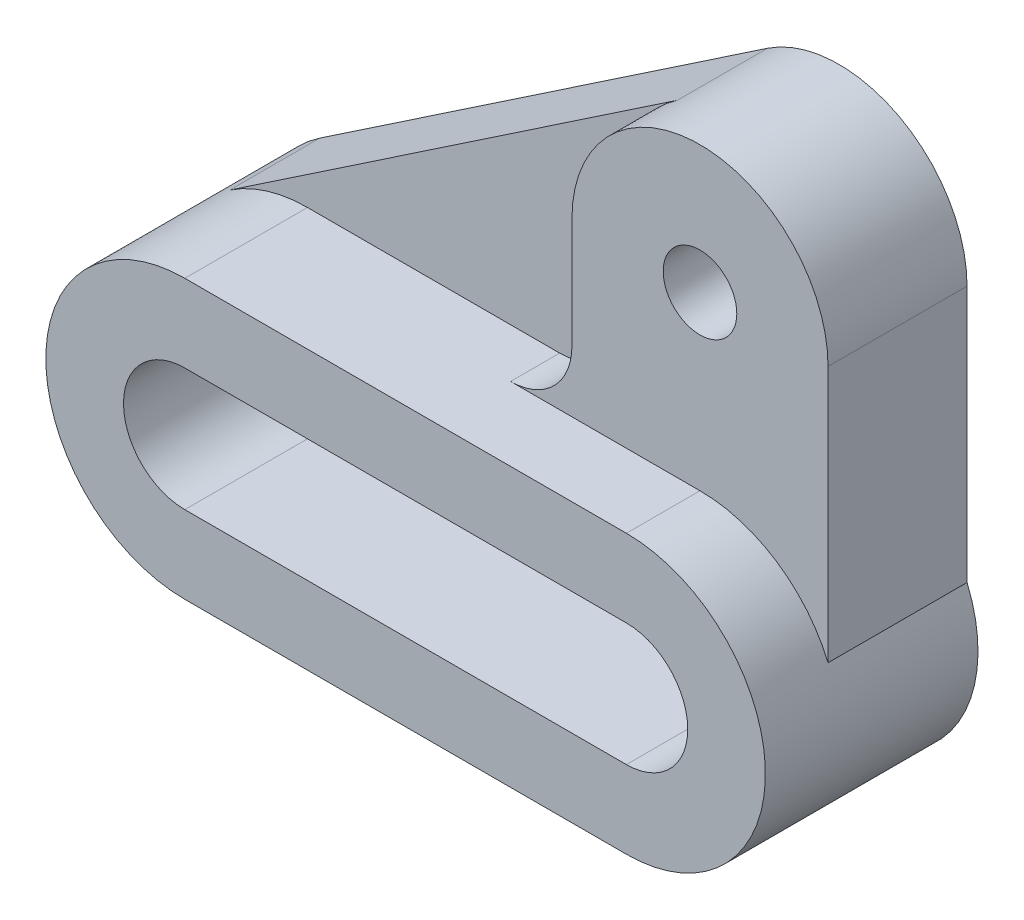
ISO-10303-21;
HEADER;
FILE_DESCRIPTION(('STEP AP214'),'2;1');
FILE_NAME('part.step','',(''),(''),'','','');
FILE_SCHEMA(('AUTOMOTIVE_DESIGN { 1 0 10303 214 1 1 1 1 }'));
ENDSEC;
DATA;
#1=APPLICATION_CONTEXT('core data for automotive mechanical design processes');
#2=APPLICATION_PROTOCOL_DEFINITION('international standard','automotive_design',2000,#1);
#3=PRODUCT_CONTEXT('',#1,'mechanical');
#4=PRODUCT('Part','Part','',(#3));
#5=PRODUCT_RELATED_PRODUCT_CATEGORY('part','',(#4));
#6=PRODUCT_DEFINITION_FORMATION('','',#4);
#7=PRODUCT_DEFINITION_CONTEXT('part definition',#1,'design');
#8=PRODUCT_DEFINITION('design','',#6,#7);
#9=PRODUCT_DEFINITION_SHAPE('','',#8);
#10=(LENGTH_UNIT() NAMED_UNIT(*) SI_UNIT(.MILLI.,.METRE.));
#11=(NAMED_UNIT(*) PLANE_ANGLE_UNIT() SI_UNIT($,.RADIAN.));
#12=(NAMED_UNIT(*) SI_UNIT($,.STERADIAN.) SOLID_ANGLE_UNIT());
#13=UNCERTAINTY_MEASURE_WITH_UNIT(LENGTH_MEASURE(1.E-05),#10,'distance_accuracy_value','');
#14=(GEOMETRIC_REPRESENTATION_CONTEXT(3) GLOBAL_UNCERTAINTY_ASSIGNED_CONTEXT((#13)) GLOBAL_UNIT_ASSIGNED_CONTEXT((#10,
#11,#12)) REPRESENTATION_CONTEXT('',''));
#15=CARTESIAN_POINT('',(0.,0.,0.));
#16=DIRECTION('',(0.,0.,1.));
#17=DIRECTION('',(1.,0.,0.));
#18=AXIS2_PLACEMENT_3D('',#15,#16,#17);
#19=CARTESIAN_POINT('',(0.,0.,52.));
#20=DIRECTION('',(0.,0.,-1.));
#21=DIRECTION('',(-1.,0.,0.));
#22=AXIS2_PLACEMENT_3D('',#19,#20,#21);
#23=CYLINDRICAL_SURFACE('',#22,34.);
#24=DIRECTION('',(0.,0.,-1.));
#25=VECTOR('',#24,1.);
#26=CARTESIAN_POINT('',(31.3199105560567,13.2311451794851,22.));
#27=LINE('',#26,#25);
#28=CARTESIAN_POINT('',(31.3199105560567,13.2311451794851,34.));
#29=VERTEX_POINT('',#28);
#30=CARTESIAN_POINT('',(31.3199105560567,13.2311451794851,0.));
#31=VERTEX_POINT('',#30);
#32=EDGE_CURVE('E173',#29,#31,#27,.T.);
#33=ORIENTED_EDGE('',*,*,#32,.F.);
#34=CARTESIAN_POINT('',(0.,0.,34.));
#35=DIRECTION('',(0.,0.,1.));
#36=DIRECTION('',(1.,0.,0.));
#37=AXIS2_PLACEMENT_3D('',#34,#35,#36);
#38=CIRCLE('',#37,34.);
#39=CARTESIAN_POINT('',(0.,34.,34.));
#40=VERTEX_POINT('',#39);
#41=EDGE_CURVE('E162',#29,#40,#38,.T.);
#42=ORIENTED_EDGE('',*,*,#41,.T.);
#43=DIRECTION('',(0.,0.,-1.));
#44=VECTOR('',#43,1.);
#45=CARTESIAN_POINT('',(0.,34.,52.));
#46=LINE('',#45,#44);
#47=CARTESIAN_POINT('',(0.,34.,52.));
#48=VERTEX_POINT('',#47);
#49=EDGE_CURVE('E248',#48,#40,#46,.T.);
#50=ORIENTED_EDGE('',*,*,#49,.F.);
#51=CARTESIAN_POINT('',(0.,0.,52.));
#52=DIRECTION('',(0.,0.,1.));
#53=DIRECTION('',(1.,0.,0.));
#54=AXIS2_PLACEMENT_3D('',#51,#52,#53);
#55=CIRCLE('',#54,34.);
#56=CARTESIAN_POINT('',(0.,-34.,52.));
#57=VERTEX_POINT('',#56);
#58=EDGE_CURVE('E225',#57,#48,#55,.T.);
#59=ORIENTED_EDGE('',*,*,#58,.F.);
#60=DIRECTION('',(0.,0.,-1.));
#61=VECTOR('',#60,1.);
#62=CARTESIAN_POINT('',(0.,-34.,52.));
#63=LINE('',#62,#61);
#64=CARTESIAN_POINT('',(0.,-34.,0.));
#65=VERTEX_POINT('',#64);
#66=EDGE_CURVE('E235',#57,#65,#63,.T.);
#67=ORIENTED_EDGE('',*,*,#66,.T.);
#68=CARTESIAN_POINT('',(0.,0.,0.));
#69=DIRECTION('',(0.,0.,1.));
#70=DIRECTION('',(1.,0.,0.));
#71=AXIS2_PLACEMENT_3D('',#68,#69,#70);
#72=CIRCLE('',#71,34.);
#73=EDGE_CURVE('E224',#65,#31,#72,.T.);
#74=ORIENTED_EDGE('',*,*,#73,.T.);
#75=EDGE_LOOP('',(#33,#42,#50,#59,#67,#74));
#76=FACE_BOUND('',#75,.T.);
#77=ADVANCED_FACE('F32',(#76),#23,.T.);
#78=CARTESIAN_POINT('',(0.,34.,52.));
#79=DIRECTION('',(0.,-1.,0.));
#80=DIRECTION('',(1.,0.,0.));
#81=AXIS2_PLACEMENT_3D('',#78,#79,#80);
#82=PLANE('',#81);
#83=DIRECTION('',(-1.,0.,0.));
#84=VECTOR('',#83,1.);
#85=CARTESIAN_POINT('',(0.,34.,34.));
#86=LINE('',#85,#84);
#87=CARTESIAN_POINT('',(-46.3199105560566,34.,34.));
#88=VERTEX_POINT('',#87);
#89=EDGE_CURVE('E47',#40,#88,#86,.T.);
#90=ORIENTED_EDGE('',*,*,#89,.T.);
#91=DIRECTION('',(0.,0.,1.));
#92=VECTOR('',#91,1.);
#93=CARTESIAN_POINT('',(-46.3199105560566,34.,22.));
#94=LINE('',#93,#92);
#95=CARTESIAN_POINT('',(-46.3199105560566,34.,22.));
#96=VERTEX_POINT('',#95);
#97=EDGE_CURVE('E51',#88,#96,#94,.F.);
#98=ORIENTED_EDGE('',*,*,#97,.T.);
#99=DIRECTION('',(-1.,0.,0.));
#100=VECTOR('',#99,1.);
#101=CARTESIAN_POINT('',(0.,34.,22.));
#102=LINE('',#101,#100);
#103=CARTESIAN_POINT('',(-108.,34.,22.));
#104=VERTEX_POINT('',#103);
#105=EDGE_CURVE('E183',#96,#104,#102,.T.);
#106=ORIENTED_EDGE('',*,*,#105,.T.);
#107=DIRECTION('',(0.,0.,-1.));
#108=VECTOR('',#107,1.);
#109=CARTESIAN_POINT('',(-108.,34.,52.));
#110=LINE('',#109,#108);
#111=CARTESIAN_POINT('',(-108.,34.,52.));
#112=VERTEX_POINT('',#111);
#113=EDGE_CURVE('E245',#112,#104,#110,.T.);
#114=ORIENTED_EDGE('',*,*,#113,.F.);
#115=DIRECTION('',(-1.,0.,0.));
#116=VECTOR('',#115,1.);
#117=CARTESIAN_POINT('',(0.,34.,52.));
#118=LINE('',#117,#116);
#119=EDGE_CURVE('E228',#48,#112,#118,.T.);
#120=ORIENTED_EDGE('',*,*,#119,.F.);
#121=ORIENTED_EDGE('',*,*,#49,.T.);
#122=EDGE_LOOP('',(#90,#98,#106,#114,#120,#121));
#123=FACE_BOUND('',#122,.T.);
#124=ADVANCED_FACE('F264',(#123),#82,.F.);
#125=CARTESIAN_POINT('',(0.,76.,22.));
#126=DIRECTION('',(0.,0.,1.));
#127=DIRECTION('',(1.,0.,0.));
#128=AXIS2_PLACEMENT_3D('',#125,#126,#127);
#129=PLANE('',#128);
#130=ORIENTED_EDGE('',*,*,#105,.F.);
#131=CARTESIAN_POINT('',(-46.3199105560566,49.,22.));
#132=DIRECTION('',(0.,0.,1.));
#133=DIRECTION('',(1.,0.,0.));
#134=AXIS2_PLACEMENT_3D('',#131,#132,#133);
#135=CIRCLE('',#134,15.);
#136=CARTESIAN_POINT('',(-31.3199105560567,49.,22.));
#137=VERTEX_POINT('',#136);
#138=EDGE_CURVE('E40',#96,#137,#135,.T.);
#139=ORIENTED_EDGE('',*,*,#138,.T.);
#140=DIRECTION('',(0.,-1.,0.));
#141=VECTOR('',#140,1.);
#142=CARTESIAN_POINT('',(-31.3199105560567,76.,22.));
#143=LINE('',#142,#141);
#144=CARTESIAN_POINT('',(-31.3199105560567,76.,22.));
#145=VERTEX_POINT('',#144);
#146=EDGE_CURVE('E157',#145,#137,#143,.T.);
#147=ORIENTED_EDGE('',*,*,#146,.F.);
#148=CARTESIAN_POINT('',(0.,76.,22.));
#149=DIRECTION('',(0.,0.,1.));
#150=DIRECTION('',(1.,0.,0.));
#151=AXIS2_PLACEMENT_3D('',#148,#149,#150);
#152=CIRCLE('',#151,31.3199105560567);
#153=CARTESIAN_POINT('',(-17.5008769106663,101.974143000243,22.));
#154=VERTEX_POINT('',#153);
#155=EDGE_CURVE('E161',#145,#154,#152,.F.);
#156=ORIENTED_EDGE('',*,*,#155,.T.);
#157=DIRECTION('',(-0.829317278979922,-0.558777997764173,0.));
#158=VECTOR('',#157,1.);
#159=CARTESIAN_POINT('',(-17.5008769106663,101.974143000243,22.));
#160=LINE('',#159,#158);
#161=CARTESIAN_POINT('',(-126.998451923982,28.1967874853173,22.));
#162=VERTEX_POINT('',#161);
#163=EDGE_CURVE('E170',#154,#162,#160,.T.);
#164=ORIENTED_EDGE('',*,*,#163,.T.);
#165=CARTESIAN_POINT('',(-108.,0.,22.));
#166=DIRECTION('',(0.,0.,1.));
#167=DIRECTION('',(1.,0.,0.));
#168=AXIS2_PLACEMENT_3D('',#165,#166,#167);
#169=CIRCLE('',#168,34.);
#170=EDGE_CURVE('E250',#104,#162,#169,.T.);
#171=ORIENTED_EDGE('',*,*,#170,.F.);
#172=EDGE_LOOP('',(#130,#139,#147,#156,#164,#171));
#173=FACE_BOUND('',#172,.T.);
#174=ADVANCED_FACE('F257',(#173),#129,.T.);
#175=CARTESIAN_POINT('',(-108.,0.,52.));
#176=DIRECTION('',(0.,0.,-1.));
#177=DIRECTION('',(-1.,0.,0.));
#178=AXIS2_PLACEMENT_3D('',#175,#176,#177);
#179=CYLINDRICAL_SURFACE('',#178,34.);
#180=DIRECTION('',(0.,0.,-1.));
#181=VECTOR('',#180,1.);
#182=CARTESIAN_POINT('',(-126.998451923982,28.1967874853173,22.));
#183=LINE('',#182,#181);
#184=CARTESIAN_POINT('',(-126.998451923982,28.1967874853173,0.));
#185=VERTEX_POINT('',#184);
#186=EDGE_CURVE('E187',#162,#185,#183,.T.);
#187=ORIENTED_EDGE('',*,*,#186,.T.);
#188=CARTESIAN_POINT('',(-108.,0.,0.));
#189=DIRECTION('',(0.,0.,1.));
#190=DIRECTION('',(1.,0.,0.));
#191=AXIS2_PLACEMENT_3D('',#188,#189,#190);
#192=CIRCLE('',#191,34.);
#193=CARTESIAN_POINT('',(-108.,-34.,0.));
#194=VERTEX_POINT('',#193);
#195=EDGE_CURVE('E237',#185,#194,#192,.T.);
#196=ORIENTED_EDGE('',*,*,#195,.T.);
#197=DIRECTION('',(0.,0.,-1.));
#198=VECTOR('',#197,1.);
#199=CARTESIAN_POINT('',(-108.,-34.,52.));
#200=LINE('',#199,#198);
#201=CARTESIAN_POINT('',(-108.,-34.,52.));
#202=VERTEX_POINT('',#201);
#203=EDGE_CURVE('E242',#202,#194,#200,.T.);
#204=ORIENTED_EDGE('',*,*,#203,.F.);
#205=CARTESIAN_POINT('',(-108.,0.,52.));
#206=DIRECTION('',(0.,0.,1.));
#207=DIRECTION('',(1.,0.,0.));
#208=AXIS2_PLACEMENT_3D('',#205,#206,#207);
#209=CIRCLE('',#208,34.);
#210=EDGE_CURVE('E231',#112,#202,#209,.T.);
#211=ORIENTED_EDGE('',*,*,#210,.F.);
#212=ORIENTED_EDGE('',*,*,#113,.T.);
#213=ORIENTED_EDGE('',*,*,#170,.T.);
#214=EDGE_LOOP('',(#187,#196,#204,#211,#212,#213));
#215=FACE_BOUND('',#214,.T.);
#216=ADVANCED_FACE('F289',(#215),#179,.T.);
#217=CARTESIAN_POINT('',(0.,0.,52.));
#218=DIRECTION('',(0.,0.,1.));
#219=DIRECTION('',(1.,0.,0.));
#220=AXIS2_PLACEMENT_3D('',#217,#218,#219);
#221=PLANE('',#220);
#222=ORIENTED_EDGE('',*,*,#58,.T.);
#223=ORIENTED_EDGE('',*,*,#119,.T.);
#224=ORIENTED_EDGE('',*,*,#210,.T.);
#225=DIRECTION('',(1.,0.,0.));
#226=VECTOR('',#225,1.);
#227=CARTESIAN_POINT('',(0.,-34.,52.));
#228=LINE('',#227,#226);
#229=EDGE_CURVE('E233',#202,#57,#228,.T.);
#230=ORIENTED_EDGE('',*,*,#229,.T.);
#231=EDGE_LOOP('',(#222,#223,#224,#230));
#232=FACE_BOUND('',#231,.T.);
#233=DIRECTION('',(-1.,0.,0.));
#234=VECTOR('',#233,1.);
#235=CARTESIAN_POINT('',(0.,15.,52.));
#236=LINE('',#235,#234);
#237=CARTESIAN_POINT('',(0.,15.,52.));
#238=VERTEX_POINT('',#237);
#239=CARTESIAN_POINT('',(-108.,15.,52.));
#240=VERTEX_POINT('',#239);
#241=EDGE_CURVE('E196',#238,#240,#236,.T.);
#242=ORIENTED_EDGE('',*,*,#241,.F.);
#243=CARTESIAN_POINT('',(0.,0.,52.));
#244=DIRECTION('',(0.,0.,1.));
#245=DIRECTION('',(1.,0.,0.));
#246=AXIS2_PLACEMENT_3D('',#243,#244,#245);
#247=CIRCLE('',#246,15.);
#248=CARTESIAN_POINT('',(0.,-15.,52.));
#249=VERTEX_POINT('',#248);
#250=EDGE_CURVE('E194',#249,#238,#247,.T.);
#251=ORIENTED_EDGE('',*,*,#250,.F.);
#252=DIRECTION('',(1.,0.,0.));
#253=VECTOR('',#252,1.);
#254=CARTESIAN_POINT('',(0.,-15.,52.));
#255=LINE('',#254,#253);
#256=CARTESIAN_POINT('',(-108.,-15.,52.));
#257=VERTEX_POINT('',#256);
#258=EDGE_CURVE('E202',#257,#249,#255,.T.);
#259=ORIENTED_EDGE('',*,*,#258,.F.);
#260=CARTESIAN_POINT('',(-108.,0.,52.));
#261=DIRECTION('',(0.,0.,1.));
#262=DIRECTION('',(1.,0.,0.));
#263=AXIS2_PLACEMENT_3D('',#260,#261,#262);
#264=CIRCLE('',#263,15.);
#265=EDGE_CURVE('E199',#240,#257,#264,.T.);
#266=ORIENTED_EDGE('',*,*,#265,.F.);
#267=EDGE_LOOP('',(#242,#251,#259,#266));
#268=FACE_BOUND('',#267,.T.);
#269=ADVANCED_FACE('F268',(#232,#268),#221,.T.);
#270=CARTESIAN_POINT('',(0.,0.,0.));
#271=DIRECTION('',(0.,0.,1.));
#272=DIRECTION('',(1.,0.,0.));
#273=AXIS2_PLACEMENT_3D('',#270,#271,#272);
#274=PLANE('',#273);
#275=CARTESIAN_POINT('',(0.,76.,0.));
#276=DIRECTION('',(0.,0.,1.));
#277=DIRECTION('',(1.,0.,0.));
#278=AXIS2_PLACEMENT_3D('',#275,#276,#277);
#279=CIRCLE('',#278,9.);
#280=CARTESIAN_POINT('',(9.,76.,0.));
#281=VERTEX_POINT('',#280);
#282=EDGE_CURVE('E260',#281,#281,#279,.T.);
#283=ORIENTED_EDGE('',*,*,#282,.T.);
#284=EDGE_LOOP('',(#283));
#285=FACE_BOUND('',#284,.T.);
#286=ORIENTED_EDGE('',*,*,#195,.F.);
#287=DIRECTION('',(-0.829317278979922,-0.558777997764173,0.));
#288=VECTOR('',#287,1.);
#289=CARTESIAN_POINT('',(-17.5008769106663,101.974143000243,0.));
#290=LINE('',#289,#288);
#291=CARTESIAN_POINT('',(-17.5008769106663,101.974143000243,0.));
#292=VERTEX_POINT('',#291);
#293=EDGE_CURVE('E177',#292,#185,#290,.T.);
#294=ORIENTED_EDGE('',*,*,#293,.F.);
#295=CARTESIAN_POINT('',(0.,76.,0.));
#296=DIRECTION('',(0.,0.,1.));
#297=DIRECTION('',(1.,0.,0.));
#298=AXIS2_PLACEMENT_3D('',#295,#296,#297);
#299=CIRCLE('',#298,31.3199105560567);
#300=CARTESIAN_POINT('',(31.3199105560567,76.,0.));
#301=VERTEX_POINT('',#300);
#302=EDGE_CURVE('E174',#301,#292,#299,.T.);
#303=ORIENTED_EDGE('',*,*,#302,.F.);
#304=DIRECTION('',(0.,-1.,0.));
#305=VECTOR('',#304,1.);
#306=CARTESIAN_POINT('',(31.3199105560567,76.,0.));
#307=LINE('',#306,#305);
#308=EDGE_CURVE('E165',#301,#31,#307,.T.);
#309=ORIENTED_EDGE('',*,*,#308,.T.);
#310=ORIENTED_EDGE('',*,*,#73,.F.);
#311=DIRECTION('',(1.,0.,0.));
#312=VECTOR('',#311,1.);
#313=CARTESIAN_POINT('',(0.,-34.,0.));
#314=LINE('',#313,#312);
#315=EDGE_CURVE('E229',#194,#65,#314,.T.);
#316=ORIENTED_EDGE('',*,*,#315,.F.);
#317=EDGE_LOOP('',(#286,#294,#303,#309,#310,#316));
#318=FACE_BOUND('',#317,.T.);
#319=CARTESIAN_POINT('',(0.,0.,0.));
#320=DIRECTION('',(0.,0.,1.));
#321=DIRECTION('',(1.,0.,0.));
#322=AXIS2_PLACEMENT_3D('',#319,#320,#321);
#323=CIRCLE('',#322,15.);
#324=CARTESIAN_POINT('',(0.,-15.,0.));
#325=VERTEX_POINT('',#324);
#326=CARTESIAN_POINT('',(0.,15.,0.));
#327=VERTEX_POINT('',#326);
#328=EDGE_CURVE('E193',#325,#327,#323,.T.);
#329=ORIENTED_EDGE('',*,*,#328,.T.);
#330=DIRECTION('',(-1.,0.,0.));
#331=VECTOR('',#330,1.);
#332=CARTESIAN_POINT('',(0.,15.,0.));
#333=LINE('',#332,#331);
#334=CARTESIAN_POINT('',(-108.,15.,0.));
#335=VERTEX_POINT('',#334);
#336=EDGE_CURVE('E207',#327,#335,#333,.T.);
#337=ORIENTED_EDGE('',*,*,#336,.T.);
#338=CARTESIAN_POINT('',(-108.,0.,0.));
#339=DIRECTION('',(0.,0.,1.));
#340=DIRECTION('',(1.,0.,0.));
#341=AXIS2_PLACEMENT_3D('',#338,#339,#340);
#342=CIRCLE('',#341,15.);
#343=CARTESIAN_POINT('',(-108.,-15.,0.));
#344=VERTEX_POINT('',#343);
#345=EDGE_CURVE('E210',#335,#344,#342,.T.);
#346=ORIENTED_EDGE('',*,*,#345,.T.);
#347=DIRECTION('',(1.,0.,0.));
#348=VECTOR('',#347,1.);
#349=CARTESIAN_POINT('',(0.,-15.,0.));
#350=LINE('',#349,#348);
#351=EDGE_CURVE('E197',#344,#325,#350,.T.);
#352=ORIENTED_EDGE('',*,*,#351,.T.);
#353=EDGE_LOOP('',(#329,#337,#346,#352));
#354=FACE_BOUND('',#353,.T.);
#355=ADVANCED_FACE('F276',(#285,#318,#354),#274,.F.);
#356=CARTESIAN_POINT('',(0.,-34.,52.));
#357=DIRECTION('',(0.,1.,0.));
#358=DIRECTION('',(-1.,0.,0.));
#359=AXIS2_PLACEMENT_3D('',#356,#357,#358);
#360=PLANE('',#359);
#361=ORIENTED_EDGE('',*,*,#315,.T.);
#362=ORIENTED_EDGE('',*,*,#66,.F.);
#363=ORIENTED_EDGE('',*,*,#229,.F.);
#364=ORIENTED_EDGE('',*,*,#203,.T.);
#365=EDGE_LOOP('',(#361,#362,#363,#364));
#366=FACE_BOUND('',#365,.T.);
#367=ADVANCED_FACE('F290',(#366),#360,.F.);
#368=CARTESIAN_POINT('',(0.,0.,52.));
#369=DIRECTION('',(0.,0.,-1.));
#370=DIRECTION('',(-1.,0.,0.));
#371=AXIS2_PLACEMENT_3D('',#368,#369,#370);
#372=CYLINDRICAL_SURFACE('',#371,15.);
#373=ORIENTED_EDGE('',*,*,#328,.F.);
#374=DIRECTION('',(0.,0.,-1.));
#375=VECTOR('',#374,1.);
#376=CARTESIAN_POINT('',(0.,-15.,52.));
#377=LINE('',#376,#375);
#378=EDGE_CURVE('E204',#249,#325,#377,.T.);
#379=ORIENTED_EDGE('',*,*,#378,.F.);
#380=ORIENTED_EDGE('',*,*,#250,.T.);
#381=DIRECTION('',(0.,0.,-1.));
#382=VECTOR('',#381,1.);
#383=CARTESIAN_POINT('',(0.,15.,52.));
#384=LINE('',#383,#382);
#385=EDGE_CURVE('E221',#238,#327,#384,.T.);
#386=ORIENTED_EDGE('',*,*,#385,.T.);
#387=EDGE_LOOP('',(#373,#379,#380,#386));
#388=FACE_BOUND('',#387,.T.);
#389=ADVANCED_FACE('F292',(#388),#372,.F.);
#390=CARTESIAN_POINT('',(0.,15.,52.));
#391=DIRECTION('',(0.,-1.,0.));
#392=DIRECTION('',(1.,0.,0.));
#393=AXIS2_PLACEMENT_3D('',#390,#391,#392);
#394=PLANE('',#393);
#395=ORIENTED_EDGE('',*,*,#336,.F.);
#396=ORIENTED_EDGE('',*,*,#385,.F.);
#397=ORIENTED_EDGE('',*,*,#241,.T.);
#398=DIRECTION('',(0.,0.,-1.));
#399=VECTOR('',#398,1.);
#400=CARTESIAN_POINT('',(-108.,15.,52.));
#401=LINE('',#400,#399);
#402=EDGE_CURVE('E219',#240,#335,#401,.T.);
#403=ORIENTED_EDGE('',*,*,#402,.T.);
#404=EDGE_LOOP('',(#395,#396,#397,#403));
#405=FACE_BOUND('',#404,.T.);
#406=ADVANCED_FACE('F298',(#405),#394,.T.);
#407=CARTESIAN_POINT('',(-108.,0.,52.));
#408=DIRECTION('',(0.,0.,-1.));
#409=DIRECTION('',(-1.,0.,0.));
#410=AXIS2_PLACEMENT_3D('',#407,#408,#409);
#411=CYLINDRICAL_SURFACE('',#410,15.);
#412=ORIENTED_EDGE('',*,*,#345,.F.);
#413=ORIENTED_EDGE('',*,*,#402,.F.);
#414=ORIENTED_EDGE('',*,*,#265,.T.);
#415=DIRECTION('',(0.,0.,-1.));
#416=VECTOR('',#415,1.);
#417=CARTESIAN_POINT('',(-108.,-15.,52.));
#418=LINE('',#417,#416);
#419=EDGE_CURVE('E217',#257,#344,#418,.T.);
#420=ORIENTED_EDGE('',*,*,#419,.T.);
#421=EDGE_LOOP('',(#412,#413,#414,#420));
#422=FACE_BOUND('',#421,.T.);
#423=ADVANCED_FACE('F330',(#422),#411,.F.);
#424=CARTESIAN_POINT('',(0.,-15.,52.));
#425=DIRECTION('',(0.,1.,0.));
#426=DIRECTION('',(-1.,0.,0.));
#427=AXIS2_PLACEMENT_3D('',#424,#425,#426);
#428=PLANE('',#427);
#429=ORIENTED_EDGE('',*,*,#351,.F.);
#430=ORIENTED_EDGE('',*,*,#419,.F.);
#431=ORIENTED_EDGE('',*,*,#258,.T.);
#432=ORIENTED_EDGE('',*,*,#378,.T.);
#433=EDGE_LOOP('',(#429,#430,#431,#432));
#434=FACE_BOUND('',#433,.T.);
#435=ADVANCED_FACE('F327',(#434),#428,.T.);
#436=CARTESIAN_POINT('',(31.3199105560567,76.,22.));
#437=DIRECTION('',(1.,0.,0.));
#438=DIRECTION('',(0.,0.,-1.));
#439=AXIS2_PLACEMENT_3D('',#436,#437,#438);
#440=PLANE('',#439);
#441=ORIENTED_EDGE('',*,*,#308,.F.);
#442=DIRECTION('',(0.,0.,-1.));
#443=VECTOR('',#442,1.);
#444=CARTESIAN_POINT('',(31.3199105560567,76.,22.));
#445=LINE('',#444,#443);
#446=CARTESIAN_POINT('',(31.3199105560567,76.,34.));
#447=VERTEX_POINT('',#446);
#448=EDGE_CURVE('E181',#447,#301,#445,.T.);
#449=ORIENTED_EDGE('',*,*,#448,.F.);
#450=DIRECTION('',(0.,1.,0.));
#451=VECTOR('',#450,1.);
#452=CARTESIAN_POINT('',(31.3199105560567,13.2311451794851,34.));
#453=LINE('',#452,#451);
#454=EDGE_CURVE('E148',#29,#447,#453,.T.);
#455=ORIENTED_EDGE('',*,*,#454,.F.);
#456=ORIENTED_EDGE('',*,*,#32,.T.);
#457=EDGE_LOOP('',(#441,#449,#455,#456));
#458=FACE_BOUND('',#457,.T.);
#459=ADVANCED_FACE('F282',(#458),#440,.T.);
#460=CARTESIAN_POINT('',(0.,76.,22.));
#461=DIRECTION('',(0.,0.,-1.));
#462=DIRECTION('',(-1.,0.,0.));
#463=AXIS2_PLACEMENT_3D('',#460,#461,#462);
#464=CYLINDRICAL_SURFACE('',#463,31.3199105560567);
#465=ORIENTED_EDGE('',*,*,#302,.T.);
#466=DIRECTION('',(0.,0.,-1.));
#467=VECTOR('',#466,1.);
#468=CARTESIAN_POINT('',(-17.5008769106663,101.974143000243,22.));
#469=LINE('',#468,#467);
#470=EDGE_CURVE('E184',#154,#292,#469,.T.);
#471=ORIENTED_EDGE('',*,*,#470,.F.);
#472=ORIENTED_EDGE('',*,*,#155,.F.);
#473=DIRECTION('',(0.,0.,-1.));
#474=VECTOR('',#473,1.);
#475=CARTESIAN_POINT('',(-31.3199105560567,76.,34.));
#476=LINE('',#475,#474);
#477=CARTESIAN_POINT('',(-31.3199105560567,76.,34.));
#478=VERTEX_POINT('',#477);
#479=EDGE_CURVE('E143',#478,#145,#476,.T.);
#480=ORIENTED_EDGE('',*,*,#479,.F.);
#481=CARTESIAN_POINT('',(0.,76.,34.));
#482=DIRECTION('',(0.,0.,1.));
#483=DIRECTION('',(1.,0.,0.));
#484=AXIS2_PLACEMENT_3D('',#481,#482,#483);
#485=CIRCLE('',#484,31.3199105560567);
#486=EDGE_CURVE('E149',#447,#478,#485,.T.);
#487=ORIENTED_EDGE('',*,*,#486,.F.);
#488=ORIENTED_EDGE('',*,*,#448,.T.);
#489=EDGE_LOOP('',(#465,#471,#472,#480,#487,#488));
#490=FACE_BOUND('',#489,.T.);
#491=ADVANCED_FACE('F159',(#490),#464,.T.);
#492=CARTESIAN_POINT('',(-17.5008769106663,101.974143000243,22.));
#493=DIRECTION('',(0.558777997764173,-0.829317278979922,0.));
#494=DIRECTION('',(0.829317278979922,0.558777997764173,0.));
#495=AXIS2_PLACEMENT_3D('',#492,#493,#494);
#496=PLANE('',#495);
#497=ORIENTED_EDGE('',*,*,#293,.T.);
#498=ORIENTED_EDGE('',*,*,#186,.F.);
#499=ORIENTED_EDGE('',*,*,#163,.F.);
#500=ORIENTED_EDGE('',*,*,#470,.T.);
#501=EDGE_LOOP('',(#497,#498,#499,#500));
#502=FACE_BOUND('',#501,.T.);
#503=ADVANCED_FACE('F285',(#502),#496,.F.);
#504=CARTESIAN_POINT('',(0.,76.,34.));
#505=DIRECTION('',(0.,0.,1.));
#506=DIRECTION('',(1.,0.,0.));
#507=AXIS2_PLACEMENT_3D('',#504,#505,#506);
#508=PLANE('',#507);
#509=CARTESIAN_POINT('',(0.,76.,34.));
#510=DIRECTION('',(0.,0.,1.));
#511=DIRECTION('',(1.,0.,0.));
#512=AXIS2_PLACEMENT_3D('',#509,#510,#511);
#513=CIRCLE('',#512,8.99999999999999);
#514=CARTESIAN_POINT('',(8.99999999999999,76.,34.));
#515=VERTEX_POINT('',#514);
#516=EDGE_CURVE('E468',#515,#515,#513,.T.);
#517=ORIENTED_EDGE('',*,*,#516,.F.);
#518=EDGE_LOOP('',(#517));
#519=FACE_BOUND('',#518,.T.);
#520=ORIENTED_EDGE('',*,*,#41,.F.);
#521=ORIENTED_EDGE('',*,*,#454,.T.);
#522=ORIENTED_EDGE('',*,*,#486,.T.);
#523=DIRECTION('',(0.,-1.,0.));
#524=VECTOR('',#523,1.);
#525=CARTESIAN_POINT('',(-31.3199105560567,76.,34.));
#526=LINE('',#525,#524);
#527=CARTESIAN_POINT('',(-31.3199105560567,49.,34.));
#528=VERTEX_POINT('',#527);
#529=EDGE_CURVE('E138',#478,#528,#526,.T.);
#530=ORIENTED_EDGE('',*,*,#529,.T.);
#531=CARTESIAN_POINT('',(-46.3199105560566,49.,34.));
#532=DIRECTION('',(0.,0.,1.));
#533=DIRECTION('',(1.,0.,0.));
#534=AXIS2_PLACEMENT_3D('',#531,#532,#533);
#535=CIRCLE('',#534,15.);
#536=EDGE_CURVE('E11',#528,#88,#535,.F.);
#537=ORIENTED_EDGE('',*,*,#536,.T.);
#538=ORIENTED_EDGE('',*,*,#89,.F.);
#539=EDGE_LOOP('',(#520,#521,#522,#530,#537,#538));
#540=FACE_BOUND('',#539,.T.);
#541=ADVANCED_FACE('F154',(#519,#540),#508,.T.);
#542=CARTESIAN_POINT('',(-31.3199105560567,76.,34.));
#543=DIRECTION('',(1.,0.,0.));
#544=DIRECTION('',(0.,0.,-1.));
#545=AXIS2_PLACEMENT_3D('',#542,#543,#544);
#546=PLANE('',#545);
#547=ORIENTED_EDGE('',*,*,#146,.T.);
#548=DIRECTION('',(0.,0.,1.));
#549=VECTOR('',#548,1.);
#550=CARTESIAN_POINT('',(-31.3199105560567,49.,34.));
#551=LINE('',#550,#549);
#552=EDGE_CURVE('E146',#137,#528,#551,.T.);
#553=ORIENTED_EDGE('',*,*,#552,.T.);
#554=ORIENTED_EDGE('',*,*,#529,.F.);
#555=ORIENTED_EDGE('',*,*,#479,.T.);
#556=EDGE_LOOP('',(#547,#553,#554,#555));
#557=FACE_BOUND('',#556,.T.);
#558=ADVANCED_FACE('F141',(#557),#546,.F.);
#559=CARTESIAN_POINT('',(0.,76.,34.));
#560=DIRECTION('',(0.,0.,1.));
#561=DIRECTION('',(1.,0.,0.));
#562=AXIS2_PLACEMENT_3D('',#559,#560,#561);
#563=CYLINDRICAL_SURFACE('',#562,8.99999999999999);
#564=ORIENTED_EDGE('',*,*,#282,.F.);
#565=EDGE_LOOP('',(#564));
#566=FACE_BOUND('',#565,.T.);
#567=ORIENTED_EDGE('',*,*,#516,.T.);
#568=EDGE_LOOP('',(#567));
#569=FACE_BOUND('',#568,.T.);
#570=ADVANCED_FACE('F383',(#566,#569),#563,.F.);
#571=CARTESIAN_POINT('',(-46.3199105560566,49.,34.));
#572=DIRECTION('',(0.,0.,-1.));
#573=DIRECTION('',(-1.,0.,0.));
#574=AXIS2_PLACEMENT_3D('',#571,#572,#573);
#575=CYLINDRICAL_SURFACE('',#574,15.);
#576=ORIENTED_EDGE('',*,*,#138,.F.);
#577=ORIENTED_EDGE('',*,*,#97,.F.);
#578=ORIENTED_EDGE('',*,*,#536,.F.);
#579=ORIENTED_EDGE('',*,*,#552,.F.);
#580=EDGE_LOOP('',(#576,#577,#578,#579));
#581=FACE_BOUND('',#580,.T.);
#582=ADVANCED_FACE('F34',(#581),#575,.F.);
#583=CLOSED_SHELL('',(#77,#124,#174,#216,#269,#355,#367,#389,#406,#423,#435,#459,#491,#503,#541,
#558,#570,#582));
#584=MANIFOLD_SOLID_BREP('B2',#583);
#585=ADVANCED_BREP_SHAPE_REPRESENTATION('',(#18,#584),#14);
#586=SHAPE_DEFINITION_REPRESENTATION(#9,#585);
ENDSEC;
END-ISO-10303-21;
